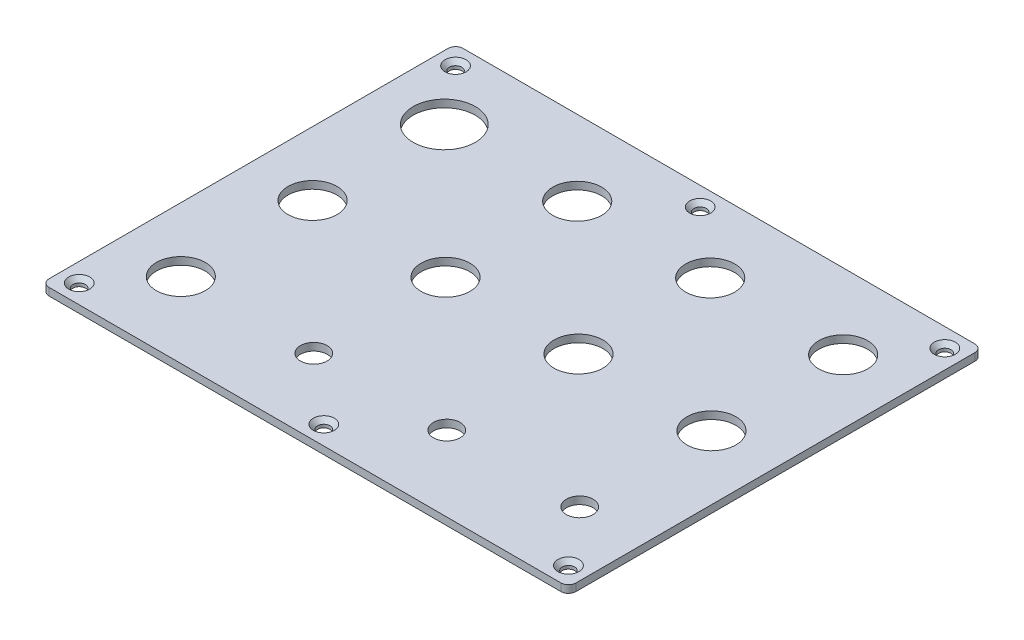
ISO-10303-21;
HEADER;
FILE_DESCRIPTION(('STEP AP214'),'2;1');
FILE_NAME('part.step','',(''),(''),'','','');
FILE_SCHEMA(('AUTOMOTIVE_DESIGN { 1 0 10303 214 1 1 1 1 }'));
ENDSEC;
DATA;
#1=APPLICATION_CONTEXT('core data for automotive mechanical design processes');
#2=APPLICATION_PROTOCOL_DEFINITION('international standard','automotive_design',2000,#1);
#3=PRODUCT_CONTEXT('',#1,'mechanical');
#4=PRODUCT('Part','Part','',(#3));
#5=PRODUCT_RELATED_PRODUCT_CATEGORY('part','',(#4));
#6=PRODUCT_DEFINITION_FORMATION('','',#4);
#7=PRODUCT_DEFINITION_CONTEXT('part definition',#1,'design');
#8=PRODUCT_DEFINITION('design','',#6,#7);
#9=PRODUCT_DEFINITION_SHAPE('','',#8);
#10=(LENGTH_UNIT() NAMED_UNIT(*) SI_UNIT(.MILLI.,.METRE.));
#11=(NAMED_UNIT(*) PLANE_ANGLE_UNIT() SI_UNIT($,.RADIAN.));
#12=(NAMED_UNIT(*) SI_UNIT($,.STERADIAN.) SOLID_ANGLE_UNIT());
#13=UNCERTAINTY_MEASURE_WITH_UNIT(LENGTH_MEASURE(1.E-05),#10,'distance_accuracy_value','');
#14=(GEOMETRIC_REPRESENTATION_CONTEXT(3) GLOBAL_UNCERTAINTY_ASSIGNED_CONTEXT((#13)) GLOBAL_UNIT_ASSIGNED_CONTEXT((#10,
#11,#12)) REPRESENTATION_CONTEXT('',''));
#15=CARTESIAN_POINT('',(0.,0.,0.));
#16=DIRECTION('',(0.,0.,1.));
#17=DIRECTION('',(1.,0.,0.));
#18=AXIS2_PLACEMENT_3D('',#15,#16,#17);
#19=CARTESIAN_POINT('',(-138.,2.,-1.99999999999999));
#20=DIRECTION('',(0.,-1.,0.));
#21=DIRECTION('',(0.,0.,-1.));
#22=AXIS2_PLACEMENT_3D('',#19,#20,#21);
#23=CYLINDRICAL_SURFACE('',#22,2.);
#24=DIRECTION('',(0.,-1.,0.));
#25=VECTOR('',#24,1.);
#26=CARTESIAN_POINT('',(-138.,2.,0.));
#27=LINE('',#26,#25);
#28=CARTESIAN_POINT('',(-138.,2.,0.));
#29=VERTEX_POINT('',#28);
#30=CARTESIAN_POINT('',(-138.,0.,0.));
#31=VERTEX_POINT('',#30);
#32=EDGE_CURVE('E207',#29,#31,#27,.T.);
#33=ORIENTED_EDGE('',*,*,#32,.F.);
#34=CARTESIAN_POINT('',(-138.,2.,-1.99999999999999));
#35=DIRECTION('',(0.,1.,0.));
#36=DIRECTION('',(0.,0.,1.));
#37=AXIS2_PLACEMENT_3D('',#34,#35,#36);
#38=CIRCLE('',#37,2.);
#39=CARTESIAN_POINT('',(-140.,2.,-1.99999999999999));
#40=VERTEX_POINT('',#39);
#41=EDGE_CURVE('E40',#40,#29,#38,.T.);
#42=ORIENTED_EDGE('',*,*,#41,.F.);
#43=DIRECTION('',(0.,-1.,0.));
#44=VECTOR('',#43,1.);
#45=CARTESIAN_POINT('',(-140.,2.,-1.99999999999999));
#46=LINE('',#45,#44);
#47=CARTESIAN_POINT('',(-140.,0.,-1.99999999999999));
#48=VERTEX_POINT('',#47);
#49=EDGE_CURVE('E210',#48,#40,#46,.F.);
#50=ORIENTED_EDGE('',*,*,#49,.F.);
#51=CARTESIAN_POINT('',(-138.,0.,-1.99999999999999));
#52=DIRECTION('',(0.,1.,0.));
#53=DIRECTION('',(0.,0.,1.));
#54=AXIS2_PLACEMENT_3D('',#51,#52,#53);
#55=CIRCLE('',#54,2.);
#56=EDGE_CURVE('E11',#31,#48,#55,.F.);
#57=ORIENTED_EDGE('',*,*,#56,.F.);
#58=EDGE_LOOP('',(#33,#42,#50,#57));
#59=FACE_BOUND('',#58,.T.);
#60=ADVANCED_FACE('F33',(#59),#23,.T.);
#61=CARTESIAN_POINT('',(-2.,2.,-2.));
#62=DIRECTION('',(0.,-1.,0.));
#63=DIRECTION('',(0.,0.,-1.));
#64=AXIS2_PLACEMENT_3D('',#61,#62,#63);
#65=CYLINDRICAL_SURFACE('',#64,2.);
#66=DIRECTION('',(0.,-1.,0.));
#67=VECTOR('',#66,1.);
#68=CARTESIAN_POINT('',(0.,2.,-2.));
#69=LINE('',#68,#67);
#70=CARTESIAN_POINT('',(0.,2.,-2.));
#71=VERTEX_POINT('',#70);
#72=CARTESIAN_POINT('',(0.,0.,-2.));
#73=VERTEX_POINT('',#72);
#74=EDGE_CURVE('E196',#71,#73,#69,.T.);
#75=ORIENTED_EDGE('',*,*,#74,.F.);
#76=CARTESIAN_POINT('',(-2.,2.,-2.));
#77=DIRECTION('',(0.,1.,0.));
#78=DIRECTION('',(0.,0.,1.));
#79=AXIS2_PLACEMENT_3D('',#76,#77,#78);
#80=CIRCLE('',#79,2.);
#81=CARTESIAN_POINT('',(-2.,2.,0.));
#82=VERTEX_POINT('',#81);
#83=EDGE_CURVE('E202',#82,#71,#80,.T.);
#84=ORIENTED_EDGE('',*,*,#83,.F.);
#85=DIRECTION('',(0.,-1.,0.));
#86=VECTOR('',#85,1.);
#87=CARTESIAN_POINT('',(-2.,2.,0.));
#88=LINE('',#87,#86);
#89=CARTESIAN_POINT('',(-2.,0.,0.));
#90=VERTEX_POINT('',#89);
#91=EDGE_CURVE('E199',#90,#82,#88,.F.);
#92=ORIENTED_EDGE('',*,*,#91,.F.);
#93=CARTESIAN_POINT('',(-2.,0.,-2.));
#94=DIRECTION('',(0.,1.,0.));
#95=DIRECTION('',(0.,0.,1.));
#96=AXIS2_PLACEMENT_3D('',#93,#94,#95);
#97=CIRCLE('',#96,2.);
#98=EDGE_CURVE('E204',#73,#90,#97,.F.);
#99=ORIENTED_EDGE('',*,*,#98,.F.);
#100=EDGE_LOOP('',(#75,#84,#92,#99));
#101=FACE_BOUND('',#100,.T.);
#102=ADVANCED_FACE('F249',(#101),#65,.T.);
#103=CARTESIAN_POINT('',(-2.,2.,-108.));
#104=DIRECTION('',(0.,-1.,0.));
#105=DIRECTION('',(0.,0.,-1.));
#106=AXIS2_PLACEMENT_3D('',#103,#104,#105);
#107=CYLINDRICAL_SURFACE('',#106,2.);
#108=DIRECTION('',(0.,-1.,0.));
#109=VECTOR('',#108,1.);
#110=CARTESIAN_POINT('',(-2.,2.,-110.));
#111=LINE('',#110,#109);
#112=CARTESIAN_POINT('',(-2.,2.,-110.));
#113=VERTEX_POINT('',#112);
#114=CARTESIAN_POINT('',(-2.,0.,-110.));
#115=VERTEX_POINT('',#114);
#116=EDGE_CURVE('E105',#113,#115,#111,.T.);
#117=ORIENTED_EDGE('',*,*,#116,.F.);
#118=CARTESIAN_POINT('',(-2.,2.,-108.));
#119=DIRECTION('',(0.,1.,0.));
#120=DIRECTION('',(0.,0.,1.));
#121=AXIS2_PLACEMENT_3D('',#118,#119,#120);
#122=CIRCLE('',#121,2.);
#123=CARTESIAN_POINT('',(0.,2.,-108.));
#124=VERTEX_POINT('',#123);
#125=EDGE_CURVE('E191',#124,#113,#122,.T.);
#126=ORIENTED_EDGE('',*,*,#125,.F.);
#127=DIRECTION('',(0.,-1.,0.));
#128=VECTOR('',#127,1.);
#129=CARTESIAN_POINT('',(0.,2.,-108.));
#130=LINE('',#129,#128);
#131=CARTESIAN_POINT('',(0.,0.,-108.));
#132=VERTEX_POINT('',#131);
#133=EDGE_CURVE('E188',#132,#124,#130,.F.);
#134=ORIENTED_EDGE('',*,*,#133,.F.);
#135=CARTESIAN_POINT('',(-2.,0.,-108.));
#136=DIRECTION('',(0.,1.,0.));
#137=DIRECTION('',(0.,0.,1.));
#138=AXIS2_PLACEMENT_3D('',#135,#136,#137);
#139=CIRCLE('',#138,2.);
#140=EDGE_CURVE('E193',#115,#132,#139,.F.);
#141=ORIENTED_EDGE('',*,*,#140,.F.);
#142=EDGE_LOOP('',(#117,#126,#134,#141));
#143=FACE_BOUND('',#142,.T.);
#144=ADVANCED_FACE('F244',(#143),#107,.T.);
#145=CARTESIAN_POINT('',(-138.,2.,-108.));
#146=DIRECTION('',(0.,-1.,0.));
#147=DIRECTION('',(0.,0.,-1.));
#148=AXIS2_PLACEMENT_3D('',#145,#146,#147);
#149=CYLINDRICAL_SURFACE('',#148,2.);
#150=DIRECTION('',(0.,-1.,0.));
#151=VECTOR('',#150,1.);
#152=CARTESIAN_POINT('',(-140.,2.,-108.));
#153=LINE('',#152,#151);
#154=CARTESIAN_POINT('',(-140.,2.,-108.));
#155=VERTEX_POINT('',#154);
#156=CARTESIAN_POINT('',(-140.,0.,-108.));
#157=VERTEX_POINT('',#156);
#158=EDGE_CURVE('E100',#155,#157,#153,.T.);
#159=ORIENTED_EDGE('',*,*,#158,.F.);
#160=CARTESIAN_POINT('',(-138.,2.,-108.));
#161=DIRECTION('',(0.,1.,0.));
#162=DIRECTION('',(0.,0.,1.));
#163=AXIS2_PLACEMENT_3D('',#160,#161,#162);
#164=CIRCLE('',#163,2.);
#165=CARTESIAN_POINT('',(-138.,2.,-110.));
#166=VERTEX_POINT('',#165);
#167=EDGE_CURVE('E106',#166,#155,#164,.T.);
#168=ORIENTED_EDGE('',*,*,#167,.F.);
#169=DIRECTION('',(0.,-1.,0.));
#170=VECTOR('',#169,1.);
#171=CARTESIAN_POINT('',(-138.,2.,-110.));
#172=LINE('',#171,#170);
#173=CARTESIAN_POINT('',(-138.,0.,-110.));
#174=VERTEX_POINT('',#173);
#175=EDGE_CURVE('E103',#174,#166,#172,.F.);
#176=ORIENTED_EDGE('',*,*,#175,.F.);
#177=CARTESIAN_POINT('',(-138.,0.,-108.));
#178=DIRECTION('',(0.,1.,0.));
#179=DIRECTION('',(0.,0.,1.));
#180=AXIS2_PLACEMENT_3D('',#177,#178,#179);
#181=CIRCLE('',#180,2.);
#182=EDGE_CURVE('E96',#157,#174,#181,.F.);
#183=ORIENTED_EDGE('',*,*,#182,.F.);
#184=EDGE_LOOP('',(#159,#168,#176,#183));
#185=FACE_BOUND('',#184,.T.);
#186=ADVANCED_FACE('F98',(#185),#149,.T.);
#187=CARTESIAN_POINT('',(0.,2.,0.));
#188=DIRECTION('',(-1.,0.,0.));
#189=DIRECTION('',(0.,0.,1.));
#190=AXIS2_PLACEMENT_3D('',#187,#188,#189);
#191=PLANE('',#190);
#192=DIRECTION('',(0.,0.,-1.));
#193=VECTOR('',#192,1.);
#194=CARTESIAN_POINT('',(0.,2.,0.));
#195=LINE('',#194,#193);
#196=EDGE_CURVE('E120',#71,#124,#195,.T.);
#197=ORIENTED_EDGE('',*,*,#196,.F.);
#198=ORIENTED_EDGE('',*,*,#74,.T.);
#199=DIRECTION('',(0.,0.,-1.));
#200=VECTOR('',#199,1.);
#201=CARTESIAN_POINT('',(0.,0.,0.));
#202=LINE('',#201,#200);
#203=EDGE_CURVE('E122',#73,#132,#202,.T.);
#204=ORIENTED_EDGE('',*,*,#203,.T.);
#205=ORIENTED_EDGE('',*,*,#133,.T.);
#206=EDGE_LOOP('',(#197,#198,#204,#205));
#207=FACE_BOUND('',#206,.T.);
#208=ADVANCED_FACE('F246',(#207),#191,.F.);
#209=CARTESIAN_POINT('',(0.,2.,-110.));
#210=DIRECTION('',(0.,0.,1.));
#211=DIRECTION('',(1.,0.,0.));
#212=AXIS2_PLACEMENT_3D('',#209,#210,#211);
#213=PLANE('',#212);
#214=DIRECTION('',(-1.,0.,0.));
#215=VECTOR('',#214,1.);
#216=CARTESIAN_POINT('',(0.,2.,-110.));
#217=LINE('',#216,#215);
#218=EDGE_CURVE('E219',#113,#166,#217,.T.);
#219=ORIENTED_EDGE('',*,*,#218,.F.);
#220=ORIENTED_EDGE('',*,*,#116,.T.);
#221=DIRECTION('',(-1.,0.,0.));
#222=VECTOR('',#221,1.);
#223=CARTESIAN_POINT('',(0.,0.,-110.));
#224=LINE('',#223,#222);
#225=EDGE_CURVE('E118',#115,#174,#224,.T.);
#226=ORIENTED_EDGE('',*,*,#225,.T.);
#227=ORIENTED_EDGE('',*,*,#175,.T.);
#228=EDGE_LOOP('',(#219,#220,#226,#227));
#229=FACE_BOUND('',#228,.T.);
#230=ADVANCED_FACE('F241',(#229),#213,.F.);
#231=CARTESIAN_POINT('',(-140.,2.,0.));
#232=DIRECTION('',(1.,0.,0.));
#233=DIRECTION('',(0.,0.,-1.));
#234=AXIS2_PLACEMENT_3D('',#231,#232,#233);
#235=PLANE('',#234);
#236=DIRECTION('',(0.,0.,1.));
#237=VECTOR('',#236,1.);
#238=CARTESIAN_POINT('',(-140.,0.,0.));
#239=LINE('',#238,#237);
#240=EDGE_CURVE('E111',#157,#48,#239,.T.);
#241=ORIENTED_EDGE('',*,*,#240,.T.);
#242=ORIENTED_EDGE('',*,*,#49,.T.);
#243=DIRECTION('',(0.,0.,1.));
#244=VECTOR('',#243,1.);
#245=CARTESIAN_POINT('',(-140.,2.,0.));
#246=LINE('',#245,#244);
#247=EDGE_CURVE('E113',#155,#40,#246,.T.);
#248=ORIENTED_EDGE('',*,*,#247,.F.);
#249=ORIENTED_EDGE('',*,*,#158,.T.);
#250=EDGE_LOOP('',(#241,#242,#248,#249));
#251=FACE_BOUND('',#250,.T.);
#252=ADVANCED_FACE('F110',(#251),#235,.F.);
#253=CARTESIAN_POINT('',(0.,2.,0.));
#254=DIRECTION('',(0.,0.,-1.));
#255=DIRECTION('',(-1.,0.,0.));
#256=AXIS2_PLACEMENT_3D('',#253,#254,#255);
#257=PLANE('',#256);
#258=DIRECTION('',(1.,0.,0.));
#259=VECTOR('',#258,1.);
#260=CARTESIAN_POINT('',(0.,2.,0.));
#261=LINE('',#260,#259);
#262=EDGE_CURVE('E114',#29,#82,#261,.T.);
#263=ORIENTED_EDGE('',*,*,#262,.F.);
#264=ORIENTED_EDGE('',*,*,#32,.T.);
#265=DIRECTION('',(1.,0.,0.));
#266=VECTOR('',#265,1.);
#267=CARTESIAN_POINT('',(0.,0.,0.));
#268=LINE('',#267,#266);
#269=EDGE_CURVE('E117',#31,#90,#268,.T.);
#270=ORIENTED_EDGE('',*,*,#269,.T.);
#271=ORIENTED_EDGE('',*,*,#91,.T.);
#272=EDGE_LOOP('',(#263,#264,#270,#271));
#273=FACE_BOUND('',#272,.T.);
#274=ADVANCED_FACE('F216',(#273),#257,.F.);
#275=CARTESIAN_POINT('',(0.,2.,0.));
#276=DIRECTION('',(0.,1.,0.));
#277=DIRECTION('',(0.,0.,1.));
#278=AXIS2_PLACEMENT_3D('',#275,#276,#277);
#279=PLANE('',#278);
#280=CARTESIAN_POINT('',(-70.,2.,-5.));
#281=DIRECTION('',(0.,1.,0.));
#282=DIRECTION('',(0.,0.,-1.));
#283=AXIS2_PLACEMENT_3D('',#280,#281,#282);
#284=CIRCLE('',#283,2.79999999999999);
#285=CARTESIAN_POINT('',(-70.,2.,-7.8));
#286=VERTEX_POINT('',#285);
#287=EDGE_CURVE('E182',#286,#286,#284,.T.);
#288=ORIENTED_EDGE('',*,*,#287,.F.);
#289=EDGE_LOOP('',(#288));
#290=FACE_BOUND('',#289,.T.);
#291=CARTESIAN_POINT('',(-70.,2.,-105.));
#292=DIRECTION('',(0.,1.,0.));
#293=DIRECTION('',(0.,0.,1.));
#294=AXIS2_PLACEMENT_3D('',#291,#292,#293);
#295=CIRCLE('',#294,2.79999999999999);
#296=CARTESIAN_POINT('',(-70.,2.,-102.2));
#297=VERTEX_POINT('',#296);
#298=EDGE_CURVE('E179',#297,#297,#295,.T.);
#299=ORIENTED_EDGE('',*,*,#298,.F.);
#300=EDGE_LOOP('',(#299));
#301=FACE_BOUND('',#300,.T.);
#302=CARTESIAN_POINT('',(-135.,2.,-4.99999999999999));
#303=DIRECTION('',(0.,1.,0.));
#304=DIRECTION('',(0.,0.,1.));
#305=AXIS2_PLACEMENT_3D('',#302,#303,#304);
#306=CIRCLE('',#305,2.80000000000001);
#307=CARTESIAN_POINT('',(-135.,2.,-2.19999999999999));
#308=VERTEX_POINT('',#307);
#309=EDGE_CURVE('E175',#308,#308,#306,.T.);
#310=ORIENTED_EDGE('',*,*,#309,.F.);
#311=EDGE_LOOP('',(#310));
#312=FACE_BOUND('',#311,.T.);
#313=CARTESIAN_POINT('',(-5.,2.,-4.99999999999999));
#314=DIRECTION('',(0.,1.,0.));
#315=DIRECTION('',(0.,0.,1.));
#316=AXIS2_PLACEMENT_3D('',#313,#314,#315);
#317=CIRCLE('',#316,2.8);
#318=CARTESIAN_POINT('',(-5.,2.,-2.19999999999999));
#319=VERTEX_POINT('',#318);
#320=EDGE_CURVE('E171',#319,#319,#317,.T.);
#321=ORIENTED_EDGE('',*,*,#320,.F.);
#322=EDGE_LOOP('',(#321));
#323=FACE_BOUND('',#322,.T.);
#324=CARTESIAN_POINT('',(-5.,2.,-105.));
#325=DIRECTION('',(0.,1.,0.));
#326=DIRECTION('',(0.,0.,1.));
#327=AXIS2_PLACEMENT_3D('',#324,#325,#326);
#328=CIRCLE('',#327,2.79999999999999);
#329=CARTESIAN_POINT('',(-5.,2.,-102.2));
#330=VERTEX_POINT('',#329);
#331=EDGE_CURVE('E167',#330,#330,#328,.T.);
#332=ORIENTED_EDGE('',*,*,#331,.F.);
#333=EDGE_LOOP('',(#332));
#334=FACE_BOUND('',#333,.T.);
#335=CARTESIAN_POINT('',(-135.,2.,-105.));
#336=DIRECTION('',(0.,1.,0.));
#337=DIRECTION('',(0.,0.,1.));
#338=AXIS2_PLACEMENT_3D('',#335,#336,#337);
#339=CIRCLE('',#338,2.8);
#340=CARTESIAN_POINT('',(-135.,2.,-102.2));
#341=VERTEX_POINT('',#340);
#342=EDGE_CURVE('E163',#341,#341,#339,.T.);
#343=ORIENTED_EDGE('',*,*,#342,.F.);
#344=EDGE_LOOP('',(#343));
#345=FACE_BOUND('',#344,.T.);
#346=CARTESIAN_POINT('',(-17.,2.,-55.));
#347=DIRECTION('',(0.,1.,0.));
#348=DIRECTION('',(0.,0.,1.));
#349=AXIS2_PLACEMENT_3D('',#346,#347,#348);
#350=CIRCLE('',#349,6.5);
#351=CARTESIAN_POINT('',(-17.,2.,-48.5));
#352=VERTEX_POINT('',#351);
#353=EDGE_CURVE('E158',#352,#352,#350,.T.);
#354=ORIENTED_EDGE('',*,*,#353,.F.);
#355=EDGE_LOOP('',(#354));
#356=FACE_BOUND('',#355,.T.);
#357=CARTESIAN_POINT('',(-52.3333333333334,2.,-55.));
#358=DIRECTION('',(0.,1.,0.));
#359=DIRECTION('',(0.,0.,1.));
#360=AXIS2_PLACEMENT_3D('',#357,#358,#359);
#361=CIRCLE('',#360,6.5);
#362=CARTESIAN_POINT('',(-52.3333333333334,2.,-48.5));
#363=VERTEX_POINT('',#362);
#364=EDGE_CURVE('E154',#363,#363,#361,.T.);
#365=ORIENTED_EDGE('',*,*,#364,.F.);
#366=EDGE_LOOP('',(#365));
#367=FACE_BOUND('',#366,.T.);
#368=CARTESIAN_POINT('',(-87.6666666666667,2.,-55.));
#369=DIRECTION('',(0.,1.,0.));
#370=DIRECTION('',(0.,0.,1.));
#371=AXIS2_PLACEMENT_3D('',#368,#369,#370);
#372=CIRCLE('',#371,6.5);
#373=CARTESIAN_POINT('',(-87.6666666666667,2.,-48.5));
#374=VERTEX_POINT('',#373);
#375=EDGE_CURVE('E150',#374,#374,#372,.T.);
#376=ORIENTED_EDGE('',*,*,#375,.F.);
#377=EDGE_LOOP('',(#376));
#378=FACE_BOUND('',#377,.T.);
#379=CARTESIAN_POINT('',(-123.,2.,-55.));
#380=DIRECTION('',(0.,1.,0.));
#381=DIRECTION('',(0.,0.,1.));
#382=AXIS2_PLACEMENT_3D('',#379,#380,#381);
#383=CIRCLE('',#382,6.5);
#384=CARTESIAN_POINT('',(-123.,2.,-48.5));
#385=VERTEX_POINT('',#384);
#386=EDGE_CURVE('E146',#385,#385,#383,.T.);
#387=ORIENTED_EDGE('',*,*,#386,.F.);
#388=EDGE_LOOP('',(#387));
#389=FACE_BOUND('',#388,.T.);
#390=CARTESIAN_POINT('',(-17.,2.,-20.));
#391=DIRECTION('',(0.,1.,0.));
#392=DIRECTION('',(0.,0.,1.));
#393=AXIS2_PLACEMENT_3D('',#390,#391,#392);
#394=CIRCLE('',#393,3.55);
#395=CARTESIAN_POINT('',(-17.,2.,-16.45));
#396=VERTEX_POINT('',#395);
#397=EDGE_CURVE('E142',#396,#396,#394,.T.);
#398=ORIENTED_EDGE('',*,*,#397,.F.);
#399=EDGE_LOOP('',(#398));
#400=FACE_BOUND('',#399,.T.);
#401=CARTESIAN_POINT('',(-52.3333333333333,2.,-20.));
#402=DIRECTION('',(0.,1.,0.));
#403=DIRECTION('',(0.,0.,1.));
#404=AXIS2_PLACEMENT_3D('',#401,#402,#403);
#405=CIRCLE('',#404,3.55);
#406=CARTESIAN_POINT('',(-52.3333333333333,2.,-16.45));
#407=VERTEX_POINT('',#406);
#408=EDGE_CURVE('E138',#407,#407,#405,.T.);
#409=ORIENTED_EDGE('',*,*,#408,.F.);
#410=EDGE_LOOP('',(#409));
#411=FACE_BOUND('',#410,.T.);
#412=CARTESIAN_POINT('',(-87.6666666666667,2.,-20.));
#413=DIRECTION('',(0.,1.,0.));
#414=DIRECTION('',(0.,0.,1.));
#415=AXIS2_PLACEMENT_3D('',#412,#413,#414);
#416=CIRCLE('',#415,3.55);
#417=CARTESIAN_POINT('',(-87.6666666666667,2.,-16.45));
#418=VERTEX_POINT('',#417);
#419=EDGE_CURVE('E134',#418,#418,#416,.T.);
#420=ORIENTED_EDGE('',*,*,#419,.F.);
#421=EDGE_LOOP('',(#420));
#422=FACE_BOUND('',#421,.T.);
#423=CARTESIAN_POINT('',(-123.,2.,-20.));
#424=DIRECTION('',(0.,1.,0.));
#425=DIRECTION('',(0.,0.,1.));
#426=AXIS2_PLACEMENT_3D('',#423,#424,#425);
#427=CIRCLE('',#426,6.5);
#428=CARTESIAN_POINT('',(-123.,2.,-13.5));
#429=VERTEX_POINT('',#428);
#430=EDGE_CURVE('E130',#429,#429,#427,.T.);
#431=ORIENTED_EDGE('',*,*,#430,.F.);
#432=EDGE_LOOP('',(#431));
#433=FACE_BOUND('',#432,.T.);
#434=CARTESIAN_POINT('',(-17.,2.,-90.));
#435=DIRECTION('',(0.,1.,0.));
#436=DIRECTION('',(0.,0.,1.));
#437=AXIS2_PLACEMENT_3D('',#434,#435,#436);
#438=CIRCLE('',#437,6.50000000000001);
#439=CARTESIAN_POINT('',(-17.,2.,-83.5));
#440=VERTEX_POINT('',#439);
#441=EDGE_CURVE('E129',#440,#440,#438,.T.);
#442=ORIENTED_EDGE('',*,*,#441,.F.);
#443=EDGE_LOOP('',(#442));
#444=FACE_BOUND('',#443,.T.);
#445=CARTESIAN_POINT('',(-52.3333333333333,2.,-90.));
#446=DIRECTION('',(0.,1.,0.));
#447=DIRECTION('',(0.,0.,1.));
#448=AXIS2_PLACEMENT_3D('',#445,#446,#447);
#449=CIRCLE('',#448,6.5);
#450=CARTESIAN_POINT('',(-52.3333333333333,2.,-83.5));
#451=VERTEX_POINT('',#450);
#452=EDGE_CURVE('E415',#451,#451,#449,.T.);
#453=ORIENTED_EDGE('',*,*,#452,.F.);
#454=EDGE_LOOP('',(#453));
#455=FACE_BOUND('',#454,.T.);
#456=CARTESIAN_POINT('',(-87.6666666666667,2.,-90.));
#457=DIRECTION('',(0.,1.,0.));
#458=DIRECTION('',(0.,0.,1.));
#459=AXIS2_PLACEMENT_3D('',#456,#457,#458);
#460=CIRCLE('',#459,6.5);
#461=CARTESIAN_POINT('',(-87.6666666666667,2.,-83.5));
#462=VERTEX_POINT('',#461);
#463=EDGE_CURVE('E234',#462,#462,#460,.T.);
#464=ORIENTED_EDGE('',*,*,#463,.F.);
#465=EDGE_LOOP('',(#464));
#466=FACE_BOUND('',#465,.T.);
#467=CARTESIAN_POINT('',(-123.,2.,-90.));
#468=DIRECTION('',(0.,1.,0.));
#469=DIRECTION('',(0.,0.,1.));
#470=AXIS2_PLACEMENT_3D('',#467,#468,#469);
#471=CIRCLE('',#470,8.24999999999999);
#472=CARTESIAN_POINT('',(-123.,2.,-81.75));
#473=VERTEX_POINT('',#472);
#474=EDGE_CURVE('E226',#473,#473,#471,.T.);
#475=ORIENTED_EDGE('',*,*,#474,.F.);
#476=EDGE_LOOP('',(#475));
#477=FACE_BOUND('',#476,.T.);
#478=ORIENTED_EDGE('',*,*,#247,.T.);
#479=ORIENTED_EDGE('',*,*,#41,.T.);
#480=ORIENTED_EDGE('',*,*,#262,.T.);
#481=ORIENTED_EDGE('',*,*,#83,.T.);
#482=ORIENTED_EDGE('',*,*,#196,.T.);
#483=ORIENTED_EDGE('',*,*,#125,.T.);
#484=ORIENTED_EDGE('',*,*,#218,.T.);
#485=ORIENTED_EDGE('',*,*,#167,.T.);
#486=EDGE_LOOP('',(#478,#479,#480,#481,#482,#483,#484,#485));
#487=FACE_BOUND('',#486,.T.);
#488=ADVANCED_FACE('F212',(#290,#301,#312,#323,#334,#345,#356,#367,#378,#389,#400,#411,#422,
#433,#444,#455,#466,#477,#487),#279,.T.);
#489=CARTESIAN_POINT('',(0.,0.,0.));
#490=DIRECTION('',(0.,1.,0.));
#491=DIRECTION('',(0.,0.,1.));
#492=AXIS2_PLACEMENT_3D('',#489,#490,#491);
#493=PLANE('',#492);
#494=CARTESIAN_POINT('',(-70.,0.,-5.));
#495=DIRECTION('',(0.,1.,0.));
#496=DIRECTION('',(0.,0.,-1.));
#497=AXIS2_PLACEMENT_3D('',#494,#495,#496);
#498=CIRCLE('',#497,1.65);
#499=CARTESIAN_POINT('',(-70.,0.,-6.65000000000001));
#500=VERTEX_POINT('',#499);
#501=EDGE_CURVE('E162',#500,#500,#498,.T.);
#502=ORIENTED_EDGE('',*,*,#501,.T.);
#503=EDGE_LOOP('',(#502));
#504=FACE_BOUND('',#503,.T.);
#505=CARTESIAN_POINT('',(-70.,0.,-105.));
#506=DIRECTION('',(0.,1.,0.));
#507=DIRECTION('',(0.,0.,1.));
#508=AXIS2_PLACEMENT_3D('',#505,#506,#507);
#509=CIRCLE('',#508,1.65);
#510=CARTESIAN_POINT('',(-70.,0.,-103.35));
#511=VERTEX_POINT('',#510);
#512=EDGE_CURVE('E377',#511,#511,#509,.T.);
#513=ORIENTED_EDGE('',*,*,#512,.T.);
#514=EDGE_LOOP('',(#513));
#515=FACE_BOUND('',#514,.T.);
#516=CARTESIAN_POINT('',(-135.,0.,-4.99999999999999));
#517=DIRECTION('',(0.,1.,0.));
#518=DIRECTION('',(0.,0.,1.));
#519=AXIS2_PLACEMENT_3D('',#516,#517,#518);
#520=CIRCLE('',#519,1.65000000000002);
#521=CARTESIAN_POINT('',(-135.,0.,-3.34999999999997));
#522=VERTEX_POINT('',#521);
#523=EDGE_CURVE('E380',#522,#522,#520,.T.);
#524=ORIENTED_EDGE('',*,*,#523,.T.);
#525=EDGE_LOOP('',(#524));
#526=FACE_BOUND('',#525,.T.);
#527=CARTESIAN_POINT('',(-5.,0.,-4.99999999999999));
#528=DIRECTION('',(0.,1.,0.));
#529=DIRECTION('',(0.,0.,1.));
#530=AXIS2_PLACEMENT_3D('',#527,#528,#529);
#531=CIRCLE('',#530,1.65);
#532=CARTESIAN_POINT('',(-5.,0.,-3.34999999999999));
#533=VERTEX_POINT('',#532);
#534=EDGE_CURVE('E387',#533,#533,#531,.T.);
#535=ORIENTED_EDGE('',*,*,#534,.T.);
#536=EDGE_LOOP('',(#535));
#537=FACE_BOUND('',#536,.T.);
#538=CARTESIAN_POINT('',(-5.,0.,-105.));
#539=DIRECTION('',(0.,1.,0.));
#540=DIRECTION('',(0.,0.,1.));
#541=AXIS2_PLACEMENT_3D('',#538,#539,#540);
#542=CIRCLE('',#541,1.65);
#543=CARTESIAN_POINT('',(-5.,0.,-103.35));
#544=VERTEX_POINT('',#543);
#545=EDGE_CURVE('E390',#544,#544,#542,.T.);
#546=ORIENTED_EDGE('',*,*,#545,.T.);
#547=EDGE_LOOP('',(#546));
#548=FACE_BOUND('',#547,.T.);
#549=CARTESIAN_POINT('',(-135.,0.,-105.));
#550=DIRECTION('',(0.,1.,0.));
#551=DIRECTION('',(0.,0.,1.));
#552=AXIS2_PLACEMENT_3D('',#549,#550,#551);
#553=CIRCLE('',#552,1.65000000000002);
#554=CARTESIAN_POINT('',(-135.,0.,-103.35));
#555=VERTEX_POINT('',#554);
#556=EDGE_CURVE('E393',#555,#555,#553,.T.);
#557=ORIENTED_EDGE('',*,*,#556,.T.);
#558=EDGE_LOOP('',(#557));
#559=FACE_BOUND('',#558,.T.);
#560=CARTESIAN_POINT('',(-17.,0.,-55.));
#561=DIRECTION('',(0.,1.,0.));
#562=DIRECTION('',(0.,0.,1.));
#563=AXIS2_PLACEMENT_3D('',#560,#561,#562);
#564=CIRCLE('',#563,6.5);
#565=CARTESIAN_POINT('',(-17.,0.,-48.5));
#566=VERTEX_POINT('',#565);
#567=EDGE_CURVE('E155',#566,#566,#564,.T.);
#568=ORIENTED_EDGE('',*,*,#567,.T.);
#569=EDGE_LOOP('',(#568));
#570=FACE_BOUND('',#569,.T.);
#571=CARTESIAN_POINT('',(-52.3333333333334,0.,-55.));
#572=DIRECTION('',(0.,1.,0.));
#573=DIRECTION('',(0.,0.,1.));
#574=AXIS2_PLACEMENT_3D('',#571,#572,#573);
#575=CIRCLE('',#574,6.5);
#576=CARTESIAN_POINT('',(-52.3333333333334,0.,-48.5));
#577=VERTEX_POINT('',#576);
#578=EDGE_CURVE('E151',#577,#577,#575,.T.);
#579=ORIENTED_EDGE('',*,*,#578,.T.);
#580=EDGE_LOOP('',(#579));
#581=FACE_BOUND('',#580,.T.);
#582=CARTESIAN_POINT('',(-87.6666666666667,0.,-55.));
#583=DIRECTION('',(0.,1.,0.));
#584=DIRECTION('',(0.,0.,1.));
#585=AXIS2_PLACEMENT_3D('',#582,#583,#584);
#586=CIRCLE('',#585,6.5);
#587=CARTESIAN_POINT('',(-87.6666666666667,0.,-48.5));
#588=VERTEX_POINT('',#587);
#589=EDGE_CURVE('E147',#588,#588,#586,.T.);
#590=ORIENTED_EDGE('',*,*,#589,.T.);
#591=EDGE_LOOP('',(#590));
#592=FACE_BOUND('',#591,.T.);
#593=CARTESIAN_POINT('',(-123.,0.,-55.));
#594=DIRECTION('',(0.,1.,0.));
#595=DIRECTION('',(0.,0.,1.));
#596=AXIS2_PLACEMENT_3D('',#593,#594,#595);
#597=CIRCLE('',#596,6.5);
#598=CARTESIAN_POINT('',(-123.,0.,-48.5));
#599=VERTEX_POINT('',#598);
#600=EDGE_CURVE('E143',#599,#599,#597,.T.);
#601=ORIENTED_EDGE('',*,*,#600,.T.);
#602=EDGE_LOOP('',(#601));
#603=FACE_BOUND('',#602,.T.);
#604=CARTESIAN_POINT('',(-17.,0.,-20.));
#605=DIRECTION('',(0.,1.,0.));
#606=DIRECTION('',(0.,0.,1.));
#607=AXIS2_PLACEMENT_3D('',#604,#605,#606);
#608=CIRCLE('',#607,3.55);
#609=CARTESIAN_POINT('',(-17.,0.,-16.45));
#610=VERTEX_POINT('',#609);
#611=EDGE_CURVE('E139',#610,#610,#608,.T.);
#612=ORIENTED_EDGE('',*,*,#611,.T.);
#613=EDGE_LOOP('',(#612));
#614=FACE_BOUND('',#613,.T.);
#615=CARTESIAN_POINT('',(-52.3333333333333,0.,-20.));
#616=DIRECTION('',(0.,1.,0.));
#617=DIRECTION('',(0.,0.,1.));
#618=AXIS2_PLACEMENT_3D('',#615,#616,#617);
#619=CIRCLE('',#618,3.55);
#620=CARTESIAN_POINT('',(-52.3333333333333,0.,-16.45));
#621=VERTEX_POINT('',#620);
#622=EDGE_CURVE('E135',#621,#621,#619,.T.);
#623=ORIENTED_EDGE('',*,*,#622,.T.);
#624=EDGE_LOOP('',(#623));
#625=FACE_BOUND('',#624,.T.);
#626=CARTESIAN_POINT('',(-87.6666666666667,0.,-20.));
#627=DIRECTION('',(0.,1.,0.));
#628=DIRECTION('',(0.,0.,1.));
#629=AXIS2_PLACEMENT_3D('',#626,#627,#628);
#630=CIRCLE('',#629,3.55);
#631=CARTESIAN_POINT('',(-87.6666666666667,0.,-16.45));
#632=VERTEX_POINT('',#631);
#633=EDGE_CURVE('E131',#632,#632,#630,.T.);
#634=ORIENTED_EDGE('',*,*,#633,.T.);
#635=EDGE_LOOP('',(#634));
#636=FACE_BOUND('',#635,.T.);
#637=CARTESIAN_POINT('',(-123.,0.,-20.));
#638=DIRECTION('',(0.,1.,0.));
#639=DIRECTION('',(0.,0.,1.));
#640=AXIS2_PLACEMENT_3D('',#637,#638,#639);
#641=CIRCLE('',#640,6.5);
#642=CARTESIAN_POINT('',(-123.,0.,-13.5));
#643=VERTEX_POINT('',#642);
#644=EDGE_CURVE('E126',#643,#643,#641,.T.);
#645=ORIENTED_EDGE('',*,*,#644,.T.);
#646=EDGE_LOOP('',(#645));
#647=FACE_BOUND('',#646,.T.);
#648=CARTESIAN_POINT('',(-17.,0.,-90.));
#649=DIRECTION('',(0.,1.,0.));
#650=DIRECTION('',(0.,0.,1.));
#651=AXIS2_PLACEMENT_3D('',#648,#649,#650);
#652=CIRCLE('',#651,6.50000000000001);
#653=CARTESIAN_POINT('',(-17.,0.,-83.5));
#654=VERTEX_POINT('',#653);
#655=EDGE_CURVE('E412',#654,#654,#652,.T.);
#656=ORIENTED_EDGE('',*,*,#655,.T.);
#657=EDGE_LOOP('',(#656));
#658=FACE_BOUND('',#657,.T.);
#659=CARTESIAN_POINT('',(-52.3333333333333,0.,-90.));
#660=DIRECTION('',(0.,1.,0.));
#661=DIRECTION('',(0.,0.,1.));
#662=AXIS2_PLACEMENT_3D('',#659,#660,#661);
#663=CIRCLE('',#662,6.5);
#664=CARTESIAN_POINT('',(-52.3333333333333,0.,-83.5));
#665=VERTEX_POINT('',#664);
#666=EDGE_CURVE('E418',#665,#665,#663,.T.);
#667=ORIENTED_EDGE('',*,*,#666,.T.);
#668=EDGE_LOOP('',(#667));
#669=FACE_BOUND('',#668,.T.);
#670=CARTESIAN_POINT('',(-87.6666666666667,0.,-90.));
#671=DIRECTION('',(0.,1.,0.));
#672=DIRECTION('',(0.,0.,1.));
#673=AXIS2_PLACEMENT_3D('',#670,#671,#672);
#674=CIRCLE('',#673,6.5);
#675=CARTESIAN_POINT('',(-87.6666666666667,0.,-83.5));
#676=VERTEX_POINT('',#675);
#677=EDGE_CURVE('E231',#676,#676,#674,.T.);
#678=ORIENTED_EDGE('',*,*,#677,.T.);
#679=EDGE_LOOP('',(#678));
#680=FACE_BOUND('',#679,.T.);
#681=CARTESIAN_POINT('',(-123.,0.,-90.));
#682=DIRECTION('',(0.,1.,0.));
#683=DIRECTION('',(0.,0.,1.));
#684=AXIS2_PLACEMENT_3D('',#681,#682,#683);
#685=CIRCLE('',#684,8.24999999999999);
#686=CARTESIAN_POINT('',(-123.,0.,-81.75));
#687=VERTEX_POINT('',#686);
#688=EDGE_CURVE('E222',#687,#687,#685,.T.);
#689=ORIENTED_EDGE('',*,*,#688,.T.);
#690=EDGE_LOOP('',(#689));
#691=FACE_BOUND('',#690,.T.);
#692=ORIENTED_EDGE('',*,*,#269,.F.);
#693=ORIENTED_EDGE('',*,*,#56,.T.);
#694=ORIENTED_EDGE('',*,*,#240,.F.);
#695=ORIENTED_EDGE('',*,*,#182,.T.);
#696=ORIENTED_EDGE('',*,*,#225,.F.);
#697=ORIENTED_EDGE('',*,*,#140,.T.);
#698=ORIENTED_EDGE('',*,*,#203,.F.);
#699=ORIENTED_EDGE('',*,*,#98,.T.);
#700=EDGE_LOOP('',(#692,#693,#694,#695,#696,#697,#698,#699));
#701=FACE_BOUND('',#700,.T.);
#702=ADVANCED_FACE('F116',(#504,#515,#526,#537,#548,#559,#570,#581,#592,#603,#614,#625,#636,
#647,#658,#669,#680,#691,#701),#493,.F.);
#703=CARTESIAN_POINT('',(-123.,0.,-90.));
#704=DIRECTION('',(0.,1.,0.));
#705=DIRECTION('',(0.,0.,1.));
#706=AXIS2_PLACEMENT_3D('',#703,#704,#705);
#707=CYLINDRICAL_SURFACE('',#706,8.24999999999999);
#708=ORIENTED_EDGE('',*,*,#688,.F.);
#709=EDGE_LOOP('',(#708));
#710=FACE_BOUND('',#709,.T.);
#711=ORIENTED_EDGE('',*,*,#474,.T.);
#712=EDGE_LOOP('',(#711));
#713=FACE_BOUND('',#712,.T.);
#714=ADVANCED_FACE('F269',(#710,#713),#707,.F.);
#715=CARTESIAN_POINT('',(-87.6666666666667,0.,-90.));
#716=DIRECTION('',(0.,1.,0.));
#717=DIRECTION('',(0.,0.,1.));
#718=AXIS2_PLACEMENT_3D('',#715,#716,#717);
#719=CYLINDRICAL_SURFACE('',#718,6.5);
#720=ORIENTED_EDGE('',*,*,#677,.F.);
#721=EDGE_LOOP('',(#720));
#722=FACE_BOUND('',#721,.T.);
#723=ORIENTED_EDGE('',*,*,#463,.T.);
#724=EDGE_LOOP('',(#723));
#725=FACE_BOUND('',#724,.T.);
#726=ADVANCED_FACE('F276',(#722,#725),#719,.F.);
#727=CARTESIAN_POINT('',(-52.3333333333333,0.,-90.));
#728=DIRECTION('',(0.,1.,0.));
#729=DIRECTION('',(0.,0.,1.));
#730=AXIS2_PLACEMENT_3D('',#727,#728,#729);
#731=CYLINDRICAL_SURFACE('',#730,6.5);
#732=ORIENTED_EDGE('',*,*,#666,.F.);
#733=EDGE_LOOP('',(#732));
#734=FACE_BOUND('',#733,.T.);
#735=ORIENTED_EDGE('',*,*,#452,.T.);
#736=EDGE_LOOP('',(#735));
#737=FACE_BOUND('',#736,.T.);
#738=ADVANCED_FACE('F280',(#734,#737),#731,.F.);
#739=CARTESIAN_POINT('',(-17.,0.,-90.));
#740=DIRECTION('',(0.,1.,0.));
#741=DIRECTION('',(0.,0.,1.));
#742=AXIS2_PLACEMENT_3D('',#739,#740,#741);
#743=CYLINDRICAL_SURFACE('',#742,6.50000000000001);
#744=ORIENTED_EDGE('',*,*,#655,.F.);
#745=EDGE_LOOP('',(#744));
#746=FACE_BOUND('',#745,.T.);
#747=ORIENTED_EDGE('',*,*,#441,.T.);
#748=EDGE_LOOP('',(#747));
#749=FACE_BOUND('',#748,.T.);
#750=ADVANCED_FACE('F284',(#746,#749),#743,.F.);
#751=CARTESIAN_POINT('',(-123.,-8.,-20.));
#752=DIRECTION('',(0.,1.,0.));
#753=DIRECTION('',(0.,0.,1.));
#754=AXIS2_PLACEMENT_3D('',#751,#752,#753);
#755=CYLINDRICAL_SURFACE('',#754,6.5);
#756=ORIENTED_EDGE('',*,*,#430,.T.);
#757=EDGE_LOOP('',(#756));
#758=FACE_BOUND('',#757,.T.);
#759=ORIENTED_EDGE('',*,*,#644,.F.);
#760=EDGE_LOOP('',(#759));
#761=FACE_BOUND('',#760,.T.);
#762=ADVANCED_FACE('F288',(#758,#761),#755,.F.);
#763=CARTESIAN_POINT('',(-87.6666666666667,-8.,-20.));
#764=DIRECTION('',(0.,1.,0.));
#765=DIRECTION('',(0.,0.,1.));
#766=AXIS2_PLACEMENT_3D('',#763,#764,#765);
#767=CYLINDRICAL_SURFACE('',#766,3.55);
#768=ORIENTED_EDGE('',*,*,#419,.T.);
#769=EDGE_LOOP('',(#768));
#770=FACE_BOUND('',#769,.T.);
#771=ORIENTED_EDGE('',*,*,#633,.F.);
#772=EDGE_LOOP('',(#771));
#773=FACE_BOUND('',#772,.T.);
#774=ADVANCED_FACE('F292',(#770,#773),#767,.F.);
#775=CARTESIAN_POINT('',(-52.3333333333333,-8.,-20.));
#776=DIRECTION('',(0.,1.,0.));
#777=DIRECTION('',(0.,0.,1.));
#778=AXIS2_PLACEMENT_3D('',#775,#776,#777);
#779=CYLINDRICAL_SURFACE('',#778,3.55);
#780=ORIENTED_EDGE('',*,*,#408,.T.);
#781=EDGE_LOOP('',(#780));
#782=FACE_BOUND('',#781,.T.);
#783=ORIENTED_EDGE('',*,*,#622,.F.);
#784=EDGE_LOOP('',(#783));
#785=FACE_BOUND('',#784,.T.);
#786=ADVANCED_FACE('F296',(#782,#785),#779,.F.);
#787=CARTESIAN_POINT('',(-17.,-8.,-20.));
#788=DIRECTION('',(0.,1.,0.));
#789=DIRECTION('',(0.,0.,1.));
#790=AXIS2_PLACEMENT_3D('',#787,#788,#789);
#791=CYLINDRICAL_SURFACE('',#790,3.55);
#792=ORIENTED_EDGE('',*,*,#397,.T.);
#793=EDGE_LOOP('',(#792));
#794=FACE_BOUND('',#793,.T.);
#795=ORIENTED_EDGE('',*,*,#611,.F.);
#796=EDGE_LOOP('',(#795));
#797=FACE_BOUND('',#796,.T.);
#798=ADVANCED_FACE('F300',(#794,#797),#791,.F.);
#799=CARTESIAN_POINT('',(-123.,-8.,-55.));
#800=DIRECTION('',(0.,1.,0.));
#801=DIRECTION('',(0.,0.,1.));
#802=AXIS2_PLACEMENT_3D('',#799,#800,#801);
#803=CYLINDRICAL_SURFACE('',#802,6.5);
#804=ORIENTED_EDGE('',*,*,#386,.T.);
#805=EDGE_LOOP('',(#804));
#806=FACE_BOUND('',#805,.T.);
#807=ORIENTED_EDGE('',*,*,#600,.F.);
#808=EDGE_LOOP('',(#807));
#809=FACE_BOUND('',#808,.T.);
#810=ADVANCED_FACE('F304',(#806,#809),#803,.F.);
#811=CARTESIAN_POINT('',(-87.6666666666667,-8.,-55.));
#812=DIRECTION('',(0.,1.,0.));
#813=DIRECTION('',(0.,0.,1.));
#814=AXIS2_PLACEMENT_3D('',#811,#812,#813);
#815=CYLINDRICAL_SURFACE('',#814,6.5);
#816=ORIENTED_EDGE('',*,*,#375,.T.);
#817=EDGE_LOOP('',(#816));
#818=FACE_BOUND('',#817,.T.);
#819=ORIENTED_EDGE('',*,*,#589,.F.);
#820=EDGE_LOOP('',(#819));
#821=FACE_BOUND('',#820,.T.);
#822=ADVANCED_FACE('F308',(#818,#821),#815,.F.);
#823=CARTESIAN_POINT('',(-52.3333333333334,-8.,-55.));
#824=DIRECTION('',(0.,1.,0.));
#825=DIRECTION('',(0.,0.,1.));
#826=AXIS2_PLACEMENT_3D('',#823,#824,#825);
#827=CYLINDRICAL_SURFACE('',#826,6.5);
#828=ORIENTED_EDGE('',*,*,#364,.T.);
#829=EDGE_LOOP('',(#828));
#830=FACE_BOUND('',#829,.T.);
#831=ORIENTED_EDGE('',*,*,#578,.F.);
#832=EDGE_LOOP('',(#831));
#833=FACE_BOUND('',#832,.T.);
#834=ADVANCED_FACE('F312',(#830,#833),#827,.F.);
#835=CARTESIAN_POINT('',(-17.,-8.,-55.));
#836=DIRECTION('',(0.,1.,0.));
#837=DIRECTION('',(0.,0.,1.));
#838=AXIS2_PLACEMENT_3D('',#835,#836,#837);
#839=CYLINDRICAL_SURFACE('',#838,6.5);
#840=ORIENTED_EDGE('',*,*,#353,.T.);
#841=EDGE_LOOP('',(#840));
#842=FACE_BOUND('',#841,.T.);
#843=ORIENTED_EDGE('',*,*,#567,.F.);
#844=EDGE_LOOP('',(#843));
#845=FACE_BOUND('',#844,.T.);
#846=ADVANCED_FACE('F316',(#842,#845),#839,.F.);
#847=CARTESIAN_POINT('',(-135.,0.,-105.));
#848=DIRECTION('',(0.,1.,0.));
#849=DIRECTION('',(0.,0.,1.));
#850=AXIS2_PLACEMENT_3D('',#847,#848,#849);
#851=CYLINDRICAL_SURFACE('',#850,1.65000000000002);
#852=CARTESIAN_POINT('',(-135.,0.850000000000015,-105.));
#853=DIRECTION('',(0.,1.,0.));
#854=DIRECTION('',(0.,0.,1.));
#855=AXIS2_PLACEMENT_3D('',#852,#853,#854);
#856=CIRCLE('',#855,1.65000000000002);
#857=CARTESIAN_POINT('',(-135.,0.850000000000015,-103.35));
#858=VERTEX_POINT('',#857);
#859=EDGE_CURVE('E159',#858,#858,#856,.T.);
#860=ORIENTED_EDGE('',*,*,#859,.T.);
#861=EDGE_LOOP('',(#860));
#862=FACE_BOUND('',#861,.T.);
#863=ORIENTED_EDGE('',*,*,#556,.F.);
#864=EDGE_LOOP('',(#863));
#865=FACE_BOUND('',#864,.T.);
#866=ADVANCED_FACE('F320',(#862,#865),#851,.F.);
#867=CARTESIAN_POINT('',(-5.,0.,-105.));
#868=DIRECTION('',(0.,1.,0.));
#869=DIRECTION('',(0.,0.,1.));
#870=AXIS2_PLACEMENT_3D('',#867,#868,#869);
#871=CYLINDRICAL_SURFACE('',#870,1.65);
#872=CARTESIAN_POINT('',(-5.,0.850000000000009,-105.));
#873=DIRECTION('',(0.,1.,0.));
#874=DIRECTION('',(0.,0.,1.));
#875=AXIS2_PLACEMENT_3D('',#872,#873,#874);
#876=CIRCLE('',#875,1.65);
#877=CARTESIAN_POINT('',(-5.,0.850000000000009,-103.35));
#878=VERTEX_POINT('',#877);
#879=EDGE_CURVE('E164',#878,#878,#876,.T.);
#880=ORIENTED_EDGE('',*,*,#879,.T.);
#881=EDGE_LOOP('',(#880));
#882=FACE_BOUND('',#881,.T.);
#883=ORIENTED_EDGE('',*,*,#545,.F.);
#884=EDGE_LOOP('',(#883));
#885=FACE_BOUND('',#884,.T.);
#886=ADVANCED_FACE('F324',(#882,#885),#871,.F.);
#887=CARTESIAN_POINT('',(-5.,0.,-4.99999999999999));
#888=DIRECTION('',(0.,1.,0.));
#889=DIRECTION('',(0.,0.,1.));
#890=AXIS2_PLACEMENT_3D('',#887,#888,#889);
#891=CYLINDRICAL_SURFACE('',#890,1.65);
#892=CARTESIAN_POINT('',(-5.,0.850000000000004,-4.99999999999999));
#893=DIRECTION('',(0.,1.,0.));
#894=DIRECTION('',(0.,0.,1.));
#895=AXIS2_PLACEMENT_3D('',#892,#893,#894);
#896=CIRCLE('',#895,1.65);
#897=CARTESIAN_POINT('',(-5.,0.850000000000004,-3.34999999999999));
#898=VERTEX_POINT('',#897);
#899=EDGE_CURVE('E168',#898,#898,#896,.T.);
#900=ORIENTED_EDGE('',*,*,#899,.T.);
#901=EDGE_LOOP('',(#900));
#902=FACE_BOUND('',#901,.T.);
#903=ORIENTED_EDGE('',*,*,#534,.F.);
#904=EDGE_LOOP('',(#903));
#905=FACE_BOUND('',#904,.T.);
#906=ADVANCED_FACE('F328',(#902,#905),#891,.F.);
#907=CARTESIAN_POINT('',(-135.,0.,-4.99999999999999));
#908=DIRECTION('',(0.,1.,0.));
#909=DIRECTION('',(0.,0.,1.));
#910=AXIS2_PLACEMENT_3D('',#907,#908,#909);
#911=CYLINDRICAL_SURFACE('',#910,1.65000000000002);
#912=CARTESIAN_POINT('',(-135.,0.850000000000015,-4.99999999999999));
#913=DIRECTION('',(0.,1.,0.));
#914=DIRECTION('',(0.,0.,1.));
#915=AXIS2_PLACEMENT_3D('',#912,#913,#914);
#916=CIRCLE('',#915,1.65000000000002);
#917=CARTESIAN_POINT('',(-135.,0.850000000000015,-3.34999999999997));
#918=VERTEX_POINT('',#917);
#919=EDGE_CURVE('E172',#918,#918,#916,.T.);
#920=ORIENTED_EDGE('',*,*,#919,.T.);
#921=EDGE_LOOP('',(#920));
#922=FACE_BOUND('',#921,.T.);
#923=ORIENTED_EDGE('',*,*,#523,.F.);
#924=EDGE_LOOP('',(#923));
#925=FACE_BOUND('',#924,.T.);
#926=ADVANCED_FACE('F332',(#922,#925),#911,.F.);
#927=CARTESIAN_POINT('',(-70.,0.,-105.));
#928=DIRECTION('',(0.,1.,0.));
#929=DIRECTION('',(0.,0.,1.));
#930=AXIS2_PLACEMENT_3D('',#927,#928,#929);
#931=CYLINDRICAL_SURFACE('',#930,1.65);
#932=CARTESIAN_POINT('',(-70.,0.850000000000015,-105.));
#933=DIRECTION('',(0.,1.,0.));
#934=DIRECTION('',(0.,0.,1.));
#935=AXIS2_PLACEMENT_3D('',#932,#933,#934);
#936=CIRCLE('',#935,1.65);
#937=CARTESIAN_POINT('',(-70.,0.850000000000015,-103.35));
#938=VERTEX_POINT('',#937);
#939=EDGE_CURVE('E176',#938,#938,#936,.T.);
#940=ORIENTED_EDGE('',*,*,#939,.T.);
#941=EDGE_LOOP('',(#940));
#942=FACE_BOUND('',#941,.T.);
#943=ORIENTED_EDGE('',*,*,#512,.F.);
#944=EDGE_LOOP('',(#943));
#945=FACE_BOUND('',#944,.T.);
#946=ADVANCED_FACE('F336',(#942,#945),#931,.F.);
#947=CARTESIAN_POINT('',(-70.,0.,-5.));
#948=DIRECTION('',(0.,1.,0.));
#949=DIRECTION('',(0.,0.,1.));
#950=AXIS2_PLACEMENT_3D('',#947,#948,#949);
#951=CYLINDRICAL_SURFACE('',#950,1.65);
#952=CARTESIAN_POINT('',(-70.,0.850000000000014,-5.));
#953=DIRECTION('',(0.,1.,0.));
#954=DIRECTION('',(0.,0.,1.));
#955=AXIS2_PLACEMENT_3D('',#952,#953,#954);
#956=CIRCLE('',#955,1.65);
#957=CARTESIAN_POINT('',(-70.,0.850000000000014,-3.35));
#958=VERTEX_POINT('',#957);
#959=EDGE_CURVE('E180',#958,#958,#956,.T.);
#960=ORIENTED_EDGE('',*,*,#959,.T.);
#961=EDGE_LOOP('',(#960));
#962=FACE_BOUND('',#961,.T.);
#963=ORIENTED_EDGE('',*,*,#501,.F.);
#964=EDGE_LOOP('',(#963));
#965=FACE_BOUND('',#964,.T.);
#966=ADVANCED_FACE('F340',(#962,#965),#951,.F.);
#967=CARTESIAN_POINT('',(-135.,2.,-105.));
#968=DIRECTION('',(0.,1.,0.));
#969=DIRECTION('',(0.,0.,1.));
#970=AXIS2_PLACEMENT_3D('',#967,#968,#969);
#971=CONICAL_SURFACE('',#970,2.8,0.78539816339745);
#972=ORIENTED_EDGE('',*,*,#342,.T.);
#973=EDGE_LOOP('',(#972));
#974=FACE_BOUND('',#973,.T.);
#975=ORIENTED_EDGE('',*,*,#859,.F.);
#976=EDGE_LOOP('',(#975));
#977=FACE_BOUND('',#976,.T.);
#978=ADVANCED_FACE('F344',(#974,#977),#971,.F.);
#979=CARTESIAN_POINT('',(-5.,2.,-105.));
#980=DIRECTION('',(0.,1.,0.));
#981=DIRECTION('',(0.,0.,1.));
#982=AXIS2_PLACEMENT_3D('',#979,#980,#981);
#983=CONICAL_SURFACE('',#982,2.79999999999999,0.78539816339745);
#984=ORIENTED_EDGE('',*,*,#331,.T.);
#985=EDGE_LOOP('',(#984));
#986=FACE_BOUND('',#985,.T.);
#987=ORIENTED_EDGE('',*,*,#879,.F.);
#988=EDGE_LOOP('',(#987));
#989=FACE_BOUND('',#988,.T.);
#990=ADVANCED_FACE('F348',(#986,#989),#983,.F.);
#991=CARTESIAN_POINT('',(-5.,2.,-4.99999999999999));
#992=DIRECTION('',(0.,1.,0.));
#993=DIRECTION('',(0.,0.,1.));
#994=AXIS2_PLACEMENT_3D('',#991,#992,#993);
#995=CONICAL_SURFACE('',#994,2.8,0.78539816339745);
#996=ORIENTED_EDGE('',*,*,#320,.T.);
#997=EDGE_LOOP('',(#996));
#998=FACE_BOUND('',#997,.T.);
#999=ORIENTED_EDGE('',*,*,#899,.F.);
#1000=EDGE_LOOP('',(#999));
#1001=FACE_BOUND('',#1000,.T.);
#1002=ADVANCED_FACE('F352',(#998,#1001),#995,.F.);
#1003=CARTESIAN_POINT('',(-135.,2.,-4.99999999999999));
#1004=DIRECTION('',(0.,1.,0.));
#1005=DIRECTION('',(0.,0.,1.));
#1006=AXIS2_PLACEMENT_3D('',#1003,#1004,#1005);
#1007=CONICAL_SURFACE('',#1006,2.80000000000001,0.78539816339745);
#1008=ORIENTED_EDGE('',*,*,#309,.T.);
#1009=EDGE_LOOP('',(#1008));
#1010=FACE_BOUND('',#1009,.T.);
#1011=ORIENTED_EDGE('',*,*,#919,.F.);
#1012=EDGE_LOOP('',(#1011));
#1013=FACE_BOUND('',#1012,.T.);
#1014=ADVANCED_FACE('F356',(#1010,#1013),#1007,.F.);
#1015=CARTESIAN_POINT('',(-70.,2.,-105.));
#1016=DIRECTION('',(0.,1.,0.));
#1017=DIRECTION('',(0.,0.,1.));
#1018=AXIS2_PLACEMENT_3D('',#1015,#1016,#1017);
#1019=CONICAL_SURFACE('',#1018,2.79999999999999,0.78539816339745);
#1020=ORIENTED_EDGE('',*,*,#298,.T.);
#1021=EDGE_LOOP('',(#1020));
#1022=FACE_BOUND('',#1021,.T.);
#1023=ORIENTED_EDGE('',*,*,#939,.F.);
#1024=EDGE_LOOP('',(#1023));
#1025=FACE_BOUND('',#1024,.T.);
#1026=ADVANCED_FACE('F360',(#1022,#1025),#1019,.F.);
#1027=CARTESIAN_POINT('',(-70.,2.,-5.));
#1028=DIRECTION('',(0.,1.,0.));
#1029=DIRECTION('',(0.,0.,-1.));
#1030=AXIS2_PLACEMENT_3D('',#1027,#1028,#1029);
#1031=CONICAL_SURFACE('',#1030,2.79999999999999,0.78539816339745);
#1032=ORIENTED_EDGE('',*,*,#287,.T.);
#1033=EDGE_LOOP('',(#1032));
#1034=FACE_BOUND('',#1033,.T.);
#1035=ORIENTED_EDGE('',*,*,#959,.F.);
#1036=EDGE_LOOP('',(#1035));
#1037=FACE_BOUND('',#1036,.T.);
#1038=ADVANCED_FACE('F364',(#1034,#1037),#1031,.F.);
#1039=CLOSED_SHELL('',(#60,#102,#144,#186,#208,#230,#252,#274,#488,#702,#714,#726,#738,#750,
#762,#774,#786,#798,#810,#822,#834,#846,#866,#886,#906,#926,#946,#966,#978,#990,#1002,#1014,
#1026,#1038));
#1040=MANIFOLD_SOLID_BREP('B2',#1039);
#1041=ADVANCED_BREP_SHAPE_REPRESENTATION('',(#18,#1040),#14);
#1042=SHAPE_DEFINITION_REPRESENTATION(#9,#1041);
ENDSEC;
END-ISO-10303-21;
